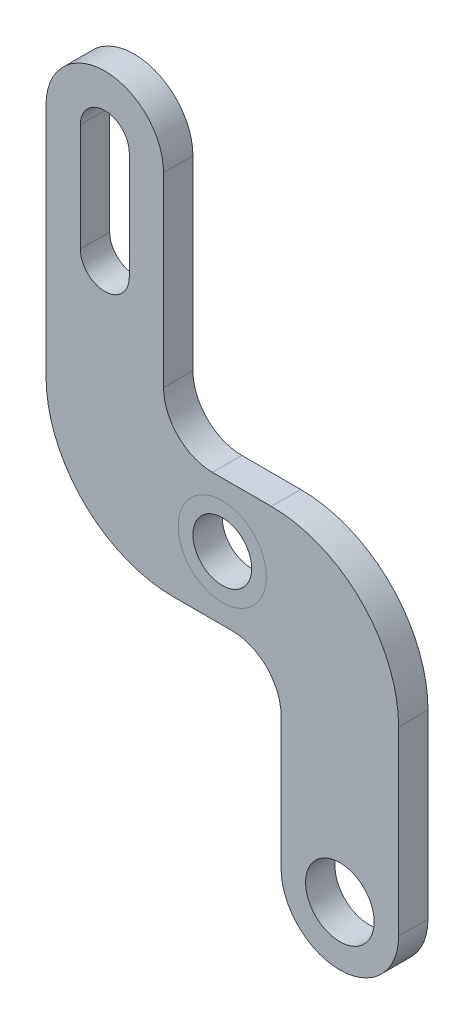
ISO-10303-21;
HEADER;
FILE_DESCRIPTION(('STEP AP214'),'2;1');
FILE_NAME('part.step','',(''),(''),'','','');
FILE_SCHEMA(('AUTOMOTIVE_DESIGN { 1 0 10303 214 1 1 1 1 }'));
ENDSEC;
DATA;
#1=APPLICATION_CONTEXT('core data for automotive mechanical design processes');
#2=APPLICATION_PROTOCOL_DEFINITION('international standard','automotive_design',2000,#1);
#3=PRODUCT_CONTEXT('',#1,'mechanical');
#4=PRODUCT('Part','Part','',(#3));
#5=PRODUCT_RELATED_PRODUCT_CATEGORY('part','',(#4));
#6=PRODUCT_DEFINITION_FORMATION('','',#4);
#7=PRODUCT_DEFINITION_CONTEXT('part definition',#1,'design');
#8=PRODUCT_DEFINITION('design','',#6,#7);
#9=PRODUCT_DEFINITION_SHAPE('','',#8);
#10=(LENGTH_UNIT() NAMED_UNIT(*) SI_UNIT(.MILLI.,.METRE.));
#11=(NAMED_UNIT(*) PLANE_ANGLE_UNIT() SI_UNIT($,.RADIAN.));
#12=(NAMED_UNIT(*) SI_UNIT($,.STERADIAN.) SOLID_ANGLE_UNIT());
#13=UNCERTAINTY_MEASURE_WITH_UNIT(LENGTH_MEASURE(1.E-05),#10,'distance_accuracy_value','');
#14=(GEOMETRIC_REPRESENTATION_CONTEXT(3) GLOBAL_UNCERTAINTY_ASSIGNED_CONTEXT((#13)) GLOBAL_UNIT_ASSIGNED_CONTEXT((#10,
#11,#12)) REPRESENTATION_CONTEXT('',''));
#15=CARTESIAN_POINT('',(0.,0.,0.));
#16=DIRECTION('',(0.,0.,1.));
#17=DIRECTION('',(1.,0.,0.));
#18=AXIS2_PLACEMENT_3D('',#15,#16,#17);
#19=CARTESIAN_POINT('',(0.,0.,1.5));
#20=DIRECTION('',(0.,0.,-1.));
#21=DIRECTION('',(-1.,0.,0.));
#22=AXIS2_PLACEMENT_3D('',#19,#20,#21);
#23=CYLINDRICAL_SURFACE('',#22,3.);
#24=CARTESIAN_POINT('',(0.,0.,1.5));
#25=DIRECTION('',(0.,0.,1.));
#26=DIRECTION('',(1.,0.,0.));
#27=AXIS2_PLACEMENT_3D('',#24,#25,#26);
#28=CIRCLE('',#27,3.);
#29=CARTESIAN_POINT('',(3.,0.,1.5));
#30=VERTEX_POINT('',#29);
#31=EDGE_CURVE('E52',#30,#30,#28,.T.);
#32=ORIENTED_EDGE('',*,*,#31,.T.);
#33=EDGE_LOOP('',(#32));
#34=FACE_BOUND('',#33,.T.);
#35=CARTESIAN_POINT('',(0.,0.,-1.5));
#36=DIRECTION('',(0.,0.,1.));
#37=DIRECTION('',(1.,0.,0.));
#38=AXIS2_PLACEMENT_3D('',#35,#36,#37);
#39=CIRCLE('',#38,3.);
#40=CARTESIAN_POINT('',(3.,0.,-1.5));
#41=VERTEX_POINT('',#40);
#42=EDGE_CURVE('E58',#41,#41,#39,.T.);
#43=ORIENTED_EDGE('',*,*,#42,.F.);
#44=EDGE_LOOP('',(#43));
#45=FACE_BOUND('',#44,.T.);
#46=ADVANCED_FACE('F45',(#34,#45),#23,.F.);
#47=CARTESIAN_POINT('',(0.,0.,1.5));
#48=DIRECTION('',(0.,0.,-1.));
#49=DIRECTION('',(-1.,0.,0.));
#50=AXIS2_PLACEMENT_3D('',#47,#48,#49);
#51=CYLINDRICAL_SURFACE('',#50,4.5);
#52=CARTESIAN_POINT('',(0.,0.,1.5));
#53=DIRECTION('',(0.,0.,1.));
#54=DIRECTION('',(1.,0.,0.));
#55=AXIS2_PLACEMENT_3D('',#52,#53,#54);
#56=CIRCLE('',#55,4.5);
#57=CARTESIAN_POINT('',(4.5,0.,1.5));
#58=VERTEX_POINT('',#57);
#59=EDGE_CURVE('E11',#58,#58,#56,.T.);
#60=ORIENTED_EDGE('',*,*,#59,.F.);
#61=EDGE_LOOP('',(#60));
#62=FACE_BOUND('',#61,.T.);
#63=CARTESIAN_POINT('',(0.,0.,-1.5));
#64=DIRECTION('',(0.,0.,1.));
#65=DIRECTION('',(1.,0.,0.));
#66=AXIS2_PLACEMENT_3D('',#63,#64,#65);
#67=CIRCLE('',#66,4.5);
#68=CARTESIAN_POINT('',(4.5,0.,-1.5));
#69=VERTEX_POINT('',#68);
#70=EDGE_CURVE('E48',#69,#69,#67,.T.);
#71=ORIENTED_EDGE('',*,*,#70,.T.);
#72=EDGE_LOOP('',(#71));
#73=FACE_BOUND('',#72,.T.);
#74=ADVANCED_FACE('F65',(#62,#73),#51,.T.);
#75=CARTESIAN_POINT('',(0.,0.,1.5));
#76=DIRECTION('',(0.,0.,1.));
#77=DIRECTION('',(1.,0.,0.));
#78=AXIS2_PLACEMENT_3D('',#75,#76,#77);
#79=PLANE('',#78);
#80=ORIENTED_EDGE('',*,*,#31,.F.);
#81=EDGE_LOOP('',(#80));
#82=FACE_BOUND('',#81,.T.);
#83=ORIENTED_EDGE('',*,*,#59,.T.);
#84=EDGE_LOOP('',(#83));
#85=FACE_BOUND('',#84,.T.);
#86=ADVANCED_FACE('F69',(#82,#85),#79,.T.);
#87=CARTESIAN_POINT('',(0.,0.,-1.5));
#88=DIRECTION('',(0.,0.,1.));
#89=DIRECTION('',(1.,0.,0.));
#90=AXIS2_PLACEMENT_3D('',#87,#88,#89);
#91=PLANE('',#90);
#92=ORIENTED_EDGE('',*,*,#42,.T.);
#93=EDGE_LOOP('',(#92));
#94=FACE_BOUND('',#93,.T.);
#95=ORIENTED_EDGE('',*,*,#70,.F.);
#96=EDGE_LOOP('',(#95));
#97=FACE_BOUND('',#96,.T.);
#98=ADVANCED_FACE('F67',(#94,#97),#91,.F.);
#99=CLOSED_SHELL('',(#46,#74,#86,#98));
#100=MANIFOLD_SOLID_BREP('B2',#99);
#101=CARTESIAN_POINT('',(12.,-25.,1.5));
#102=DIRECTION('',(0.,0.,-1.));
#103=DIRECTION('',(-1.,0.,0.));
#104=AXIS2_PLACEMENT_3D('',#101,#102,#103);
#105=CYLINDRICAL_SURFACE('',#104,6.);
#106=CARTESIAN_POINT('',(12.,-25.,-1.5));
#107=DIRECTION('',(0.,0.,1.));
#108=DIRECTION('',(1.,0.,0.));
#109=AXIS2_PLACEMENT_3D('',#106,#107,#108);
#110=CIRCLE('',#109,6.);
#111=CARTESIAN_POINT('',(18.,-25.,-1.5));
#112=VERTEX_POINT('',#111);
#113=CARTESIAN_POINT('',(6.,-25.,-1.5));
#114=VERTEX_POINT('',#113);
#115=EDGE_CURVE('E279',#112,#114,#110,.F.);
#116=ORIENTED_EDGE('',*,*,#115,.F.);
#117=DIRECTION('',(0.,0.,-1.));
#118=VECTOR('',#117,1.);
#119=CARTESIAN_POINT('',(18.,-25.,1.5));
#120=LINE('',#119,#118);
#121=CARTESIAN_POINT('',(18.,-25.,1.5));
#122=VERTEX_POINT('',#121);
#123=EDGE_CURVE('E43',#122,#112,#120,.T.);
#124=ORIENTED_EDGE('',*,*,#123,.F.);
#125=CARTESIAN_POINT('',(12.,-25.,1.5));
#126=DIRECTION('',(0.,0.,1.));
#127=DIRECTION('',(1.,0.,0.));
#128=AXIS2_PLACEMENT_3D('',#125,#126,#127);
#129=CIRCLE('',#128,6.);
#130=CARTESIAN_POINT('',(6.,-25.,1.5));
#131=VERTEX_POINT('',#130);
#132=EDGE_CURVE('E354',#122,#131,#129,.F.);
#133=ORIENTED_EDGE('',*,*,#132,.T.);
#134=DIRECTION('',(0.,0.,-1.));
#135=VECTOR('',#134,1.);
#136=CARTESIAN_POINT('',(6.,-25.,1.5));
#137=LINE('',#136,#135);
#138=EDGE_CURVE('E185',#131,#114,#137,.T.);
#139=ORIENTED_EDGE('',*,*,#138,.T.);
#140=EDGE_LOOP('',(#116,#124,#133,#139));
#141=FACE_BOUND('',#140,.T.);
#142=ADVANCED_FACE('F107',(#141),#105,.T.);
#143=CARTESIAN_POINT('',(18.,0.,1.5));
#144=DIRECTION('',(1.,0.,0.));
#145=DIRECTION('',(0.,1.,0.));
#146=AXIS2_PLACEMENT_3D('',#143,#144,#145);
#147=PLANE('',#146);
#148=DIRECTION('',(0.,-1.,0.));
#149=VECTOR('',#148,1.);
#150=CARTESIAN_POINT('',(18.,0.,-1.5));
#151=LINE('',#150,#149);
#152=CARTESIAN_POINT('',(18.,-6.5,-1.5));
#153=VERTEX_POINT('',#152);
#154=EDGE_CURVE('E281',#153,#112,#151,.T.);
#155=ORIENTED_EDGE('',*,*,#154,.F.);
#156=DIRECTION('',(0.,0.,-1.));
#157=VECTOR('',#156,1.);
#158=CARTESIAN_POINT('',(18.,-6.5,1.5));
#159=LINE('',#158,#157);
#160=CARTESIAN_POINT('',(18.,-6.5,1.5));
#161=VERTEX_POINT('',#160);
#162=EDGE_CURVE('E117',#161,#153,#159,.T.);
#163=ORIENTED_EDGE('',*,*,#162,.F.);
#164=DIRECTION('',(0.,-1.,0.));
#165=VECTOR('',#164,1.);
#166=CARTESIAN_POINT('',(18.,0.,1.5));
#167=LINE('',#166,#165);
#168=EDGE_CURVE('E362',#161,#122,#167,.T.);
#169=ORIENTED_EDGE('',*,*,#168,.T.);
#170=ORIENTED_EDGE('',*,*,#123,.T.);
#171=EDGE_LOOP('',(#155,#163,#169,#170));
#172=FACE_BOUND('',#171,.T.);
#173=ADVANCED_FACE('F408',(#172),#147,.T.);
#174=CARTESIAN_POINT('',(5.,-6.5,1.5));
#175=DIRECTION('',(0.,0.,-1.));
#176=DIRECTION('',(-1.,0.,0.));
#177=AXIS2_PLACEMENT_3D('',#174,#175,#176);
#178=CYLINDRICAL_SURFACE('',#177,13.);
#179=CARTESIAN_POINT('',(5.,-6.5,-1.5));
#180=DIRECTION('',(0.,0.,1.));
#181=DIRECTION('',(1.,0.,0.));
#182=AXIS2_PLACEMENT_3D('',#179,#180,#181);
#183=CIRCLE('',#182,13.);
#184=CARTESIAN_POINT('',(5.,6.5,-1.5));
#185=VERTEX_POINT('',#184);
#186=EDGE_CURVE('E284',#185,#153,#183,.F.);
#187=ORIENTED_EDGE('',*,*,#186,.F.);
#188=DIRECTION('',(0.,0.,-1.));
#189=VECTOR('',#188,1.);
#190=CARTESIAN_POINT('',(5.,6.5,1.5));
#191=LINE('',#190,#189);
#192=CARTESIAN_POINT('',(5.,6.5,1.5));
#193=VERTEX_POINT('',#192);
#194=EDGE_CURVE('E326',#193,#185,#191,.T.);
#195=ORIENTED_EDGE('',*,*,#194,.F.);
#196=CARTESIAN_POINT('',(5.,-6.5,1.5));
#197=DIRECTION('',(0.,0.,1.));
#198=DIRECTION('',(1.,0.,0.));
#199=AXIS2_PLACEMENT_3D('',#196,#197,#198);
#200=CIRCLE('',#199,13.);
#201=EDGE_CURVE('E365',#193,#161,#200,.F.);
#202=ORIENTED_EDGE('',*,*,#201,.T.);
#203=ORIENTED_EDGE('',*,*,#162,.T.);
#204=EDGE_LOOP('',(#187,#195,#202,#203));
#205=FACE_BOUND('',#204,.T.);
#206=ADVANCED_FACE('F413',(#205),#178,.T.);
#207=CARTESIAN_POINT('',(0.,6.5,1.5));
#208=DIRECTION('',(0.,1.,0.));
#209=DIRECTION('',(0.,0.,1.));
#210=AXIS2_PLACEMENT_3D('',#207,#208,#209);
#211=PLANE('',#210);
#212=DIRECTION('',(1.,0.,0.));
#213=VECTOR('',#212,1.);
#214=CARTESIAN_POINT('',(0.,6.5,-1.5));
#215=LINE('',#214,#213);
#216=CARTESIAN_POINT('',(-0.999999999999994,6.5,-1.5));
#217=VERTEX_POINT('',#216);
#218=EDGE_CURVE('E287',#217,#185,#215,.T.);
#219=ORIENTED_EDGE('',*,*,#218,.F.);
#220=DIRECTION('',(0.,0.,-1.));
#221=VECTOR('',#220,1.);
#222=CARTESIAN_POINT('',(-0.999999999999994,6.5,1.5));
#223=LINE('',#222,#221);
#224=CARTESIAN_POINT('',(-0.999999999999994,6.5,1.5));
#225=VERTEX_POINT('',#224);
#226=EDGE_CURVE('E324',#225,#217,#223,.T.);
#227=ORIENTED_EDGE('',*,*,#226,.F.);
#228=DIRECTION('',(1.,0.,0.));
#229=VECTOR('',#228,1.);
#230=CARTESIAN_POINT('',(0.,6.5,1.5));
#231=LINE('',#230,#229);
#232=EDGE_CURVE('E368',#225,#193,#231,.T.);
#233=ORIENTED_EDGE('',*,*,#232,.T.);
#234=ORIENTED_EDGE('',*,*,#194,.T.);
#235=EDGE_LOOP('',(#219,#227,#233,#234));
#236=FACE_BOUND('',#235,.T.);
#237=ADVANCED_FACE('F449',(#236),#211,.T.);
#238=CARTESIAN_POINT('',(-0.999999999999994,11.5,1.5));
#239=DIRECTION('',(0.,0.,-1.));
#240=DIRECTION('',(-1.,0.,0.));
#241=AXIS2_PLACEMENT_3D('',#238,#239,#240);
#242=CYLINDRICAL_SURFACE('',#241,5.);
#243=CARTESIAN_POINT('',(-0.999999999999994,11.5,-1.5));
#244=DIRECTION('',(0.,0.,1.));
#245=DIRECTION('',(1.,0.,0.));
#246=AXIS2_PLACEMENT_3D('',#243,#244,#245);
#247=CIRCLE('',#246,5.);
#248=CARTESIAN_POINT('',(-5.99999999999999,11.5,-1.5));
#249=VERTEX_POINT('',#248);
#250=EDGE_CURVE('E290',#249,#217,#247,.T.);
#251=ORIENTED_EDGE('',*,*,#250,.F.);
#252=DIRECTION('',(0.,0.,-1.));
#253=VECTOR('',#252,1.);
#254=CARTESIAN_POINT('',(-5.99999999999999,11.5,1.5));
#255=LINE('',#254,#253);
#256=CARTESIAN_POINT('',(-5.99999999999999,11.5,1.5));
#257=VERTEX_POINT('',#256);
#258=EDGE_CURVE('E322',#257,#249,#255,.T.);
#259=ORIENTED_EDGE('',*,*,#258,.F.);
#260=CARTESIAN_POINT('',(-0.999999999999994,11.5,1.5));
#261=DIRECTION('',(0.,0.,1.));
#262=DIRECTION('',(1.,0.,0.));
#263=AXIS2_PLACEMENT_3D('',#260,#261,#262);
#264=CIRCLE('',#263,5.);
#265=EDGE_CURVE('E371',#257,#225,#264,.T.);
#266=ORIENTED_EDGE('',*,*,#265,.T.);
#267=ORIENTED_EDGE('',*,*,#226,.T.);
#268=EDGE_LOOP('',(#251,#259,#266,#267));
#269=FACE_BOUND('',#268,.T.);
#270=ADVANCED_FACE('F445',(#269),#242,.F.);
#271=CARTESIAN_POINT('',(-5.99999999999999,0.,1.5));
#272=DIRECTION('',(1.,0.,0.));
#273=DIRECTION('',(0.,1.,0.));
#274=AXIS2_PLACEMENT_3D('',#271,#272,#273);
#275=PLANE('',#274);
#276=DIRECTION('',(0.,-1.,0.));
#277=VECTOR('',#276,1.);
#278=CARTESIAN_POINT('',(-5.99999999999999,0.,-1.5));
#279=LINE('',#278,#277);
#280=CARTESIAN_POINT('',(-6.,30.5,-1.5));
#281=VERTEX_POINT('',#280);
#282=EDGE_CURVE('E293',#281,#249,#279,.T.);
#283=ORIENTED_EDGE('',*,*,#282,.F.);
#284=DIRECTION('',(0.,0.,-1.));
#285=VECTOR('',#284,1.);
#286=CARTESIAN_POINT('',(-6.,30.5,1.5));
#287=LINE('',#286,#285);
#288=CARTESIAN_POINT('',(-6.,30.5,1.5));
#289=VERTEX_POINT('',#288);
#290=EDGE_CURVE('E320',#289,#281,#287,.T.);
#291=ORIENTED_EDGE('',*,*,#290,.F.);
#292=DIRECTION('',(0.,-1.,0.));
#293=VECTOR('',#292,1.);
#294=CARTESIAN_POINT('',(-5.99999999999999,0.,1.5));
#295=LINE('',#294,#293);
#296=EDGE_CURVE('E374',#289,#257,#295,.T.);
#297=ORIENTED_EDGE('',*,*,#296,.T.);
#298=ORIENTED_EDGE('',*,*,#258,.T.);
#299=EDGE_LOOP('',(#283,#291,#297,#298));
#300=FACE_BOUND('',#299,.T.);
#301=ADVANCED_FACE('F441',(#300),#275,.T.);
#302=CARTESIAN_POINT('',(-12.,30.5,1.5));
#303=DIRECTION('',(0.,0.,-1.));
#304=DIRECTION('',(-1.,0.,0.));
#305=AXIS2_PLACEMENT_3D('',#302,#303,#304);
#306=CYLINDRICAL_SURFACE('',#305,6.);
#307=CARTESIAN_POINT('',(-12.,30.5,-1.5));
#308=DIRECTION('',(0.,0.,1.));
#309=DIRECTION('',(1.,0.,0.));
#310=AXIS2_PLACEMENT_3D('',#307,#308,#309);
#311=CIRCLE('',#310,6.);
#312=CARTESIAN_POINT('',(-18.,30.5,-1.5));
#313=VERTEX_POINT('',#312);
#314=EDGE_CURVE('E296',#313,#281,#311,.F.);
#315=ORIENTED_EDGE('',*,*,#314,.F.);
#316=DIRECTION('',(0.,0.,-1.));
#317=VECTOR('',#316,1.);
#318=CARTESIAN_POINT('',(-18.,30.5,1.5));
#319=LINE('',#318,#317);
#320=CARTESIAN_POINT('',(-18.,30.5,1.5));
#321=VERTEX_POINT('',#320);
#322=EDGE_CURVE('E318',#321,#313,#319,.T.);
#323=ORIENTED_EDGE('',*,*,#322,.F.);
#324=CARTESIAN_POINT('',(-12.,30.5,1.5));
#325=DIRECTION('',(0.,0.,1.));
#326=DIRECTION('',(1.,0.,0.));
#327=AXIS2_PLACEMENT_3D('',#324,#325,#326);
#328=CIRCLE('',#327,6.);
#329=EDGE_CURVE('E377',#321,#289,#328,.F.);
#330=ORIENTED_EDGE('',*,*,#329,.T.);
#331=ORIENTED_EDGE('',*,*,#290,.T.);
#332=EDGE_LOOP('',(#315,#323,#330,#331));
#333=FACE_BOUND('',#332,.T.);
#334=ADVANCED_FACE('F438',(#333),#306,.T.);
#335=CARTESIAN_POINT('',(-18.,0.,1.5));
#336=DIRECTION('',(-1.,0.,0.));
#337=DIRECTION('',(0.,0.,1.));
#338=AXIS2_PLACEMENT_3D('',#335,#336,#337);
#339=PLANE('',#338);
#340=DIRECTION('',(0.,1.,0.));
#341=VECTOR('',#340,1.);
#342=CARTESIAN_POINT('',(-18.,0.,-1.5));
#343=LINE('',#342,#341);
#344=CARTESIAN_POINT('',(-18.,6.5,-1.5));
#345=VERTEX_POINT('',#344);
#346=EDGE_CURVE('E299',#345,#313,#343,.T.);
#347=ORIENTED_EDGE('',*,*,#346,.F.);
#348=DIRECTION('',(0.,0.,-1.));
#349=VECTOR('',#348,1.);
#350=CARTESIAN_POINT('',(-18.,6.5,1.5));
#351=LINE('',#350,#349);
#352=CARTESIAN_POINT('',(-18.,6.5,1.5));
#353=VERTEX_POINT('',#352);
#354=EDGE_CURVE('E316',#353,#345,#351,.T.);
#355=ORIENTED_EDGE('',*,*,#354,.F.);
#356=DIRECTION('',(0.,1.,0.));
#357=VECTOR('',#356,1.);
#358=CARTESIAN_POINT('',(-18.,0.,1.5));
#359=LINE('',#358,#357);
#360=EDGE_CURVE('E255',#353,#321,#359,.T.);
#361=ORIENTED_EDGE('',*,*,#360,.T.);
#362=ORIENTED_EDGE('',*,*,#322,.T.);
#363=EDGE_LOOP('',(#347,#355,#361,#362));
#364=FACE_BOUND('',#363,.T.);
#365=ADVANCED_FACE('F382',(#364),#339,.T.);
#366=CARTESIAN_POINT('',(-5.,6.5,1.5));
#367=DIRECTION('',(0.,0.,-1.));
#368=DIRECTION('',(-1.,0.,0.));
#369=AXIS2_PLACEMENT_3D('',#366,#367,#368);
#370=CYLINDRICAL_SURFACE('',#369,13.);
#371=CARTESIAN_POINT('',(-5.,6.5,-1.5));
#372=DIRECTION('',(0.,0.,1.));
#373=DIRECTION('',(1.,0.,0.));
#374=AXIS2_PLACEMENT_3D('',#371,#372,#373);
#375=CIRCLE('',#374,13.);
#376=CARTESIAN_POINT('',(-5.,-6.5,-1.5));
#377=VERTEX_POINT('',#376);
#378=EDGE_CURVE('E302',#377,#345,#375,.F.);
#379=ORIENTED_EDGE('',*,*,#378,.F.);
#380=DIRECTION('',(0.,0.,-1.));
#381=VECTOR('',#380,1.);
#382=CARTESIAN_POINT('',(-5.,-6.5,1.5));
#383=LINE('',#382,#381);
#384=CARTESIAN_POINT('',(-5.,-6.5,1.5));
#385=VERTEX_POINT('',#384);
#386=EDGE_CURVE('E241',#385,#377,#383,.T.);
#387=ORIENTED_EDGE('',*,*,#386,.F.);
#388=CARTESIAN_POINT('',(-5.,6.5,1.5));
#389=DIRECTION('',(0.,0.,1.));
#390=DIRECTION('',(1.,0.,0.));
#391=AXIS2_PLACEMENT_3D('',#388,#389,#390);
#392=CIRCLE('',#391,13.);
#393=EDGE_CURVE('E253',#385,#353,#392,.F.);
#394=ORIENTED_EDGE('',*,*,#393,.T.);
#395=ORIENTED_EDGE('',*,*,#354,.T.);
#396=EDGE_LOOP('',(#379,#387,#394,#395));
#397=FACE_BOUND('',#396,.T.);
#398=ADVANCED_FACE('F388',(#397),#370,.T.);
#399=CARTESIAN_POINT('',(0.,-6.5,1.5));
#400=DIRECTION('',(0.,-1.,0.));
#401=DIRECTION('',(1.,0.,0.));
#402=AXIS2_PLACEMENT_3D('',#399,#400,#401);
#403=PLANE('',#402);
#404=DIRECTION('',(-1.,0.,0.));
#405=VECTOR('',#404,1.);
#406=CARTESIAN_POINT('',(0.,-6.5,-1.5));
#407=LINE('',#406,#405);
#408=CARTESIAN_POINT('',(0.999999999999998,-6.5,-1.5));
#409=VERTEX_POINT('',#408);
#410=EDGE_CURVE('E238',#409,#377,#407,.T.);
#411=ORIENTED_EDGE('',*,*,#410,.F.);
#412=DIRECTION('',(0.,0.,-1.));
#413=VECTOR('',#412,1.);
#414=CARTESIAN_POINT('',(0.999999999999998,-6.5,1.5));
#415=LINE('',#414,#413);
#416=CARTESIAN_POINT('',(0.999999999999998,-6.5,1.5));
#417=VERTEX_POINT('',#416);
#418=EDGE_CURVE('E232',#417,#409,#415,.T.);
#419=ORIENTED_EDGE('',*,*,#418,.F.);
#420=DIRECTION('',(-1.,0.,0.));
#421=VECTOR('',#420,1.);
#422=CARTESIAN_POINT('',(0.,-6.5,1.5));
#423=LINE('',#422,#421);
#424=EDGE_CURVE('E236',#417,#385,#423,.T.);
#425=ORIENTED_EDGE('',*,*,#424,.T.);
#426=ORIENTED_EDGE('',*,*,#386,.T.);
#427=EDGE_LOOP('',(#411,#419,#425,#426));
#428=FACE_BOUND('',#427,.T.);
#429=ADVANCED_FACE('F234',(#428),#403,.T.);
#430=CARTESIAN_POINT('',(0.999999999999998,-11.5,1.5));
#431=DIRECTION('',(0.,0.,-1.));
#432=DIRECTION('',(-1.,0.,0.));
#433=AXIS2_PLACEMENT_3D('',#430,#431,#432);
#434=CYLINDRICAL_SURFACE('',#433,5.);
#435=CARTESIAN_POINT('',(0.999999999999998,-11.5,-1.5));
#436=DIRECTION('',(0.,0.,1.));
#437=DIRECTION('',(1.,0.,0.));
#438=AXIS2_PLACEMENT_3D('',#435,#436,#437);
#439=CIRCLE('',#438,5.);
#440=CARTESIAN_POINT('',(6.,-11.5,-1.5));
#441=VERTEX_POINT('',#440);
#442=EDGE_CURVE('E306',#409,#441,#439,.F.);
#443=ORIENTED_EDGE('',*,*,#442,.T.);
#444=DIRECTION('',(0.,0.,-1.));
#445=VECTOR('',#444,1.);
#446=CARTESIAN_POINT('',(6.,-11.5,1.5));
#447=LINE('',#446,#445);
#448=CARTESIAN_POINT('',(6.,-11.5,1.5));
#449=VERTEX_POINT('',#448);
#450=EDGE_CURVE('E242',#449,#441,#447,.T.);
#451=ORIENTED_EDGE('',*,*,#450,.F.);
#452=CARTESIAN_POINT('',(0.999999999999998,-11.5,1.5));
#453=DIRECTION('',(0.,0.,1.));
#454=DIRECTION('',(1.,0.,0.));
#455=AXIS2_PLACEMENT_3D('',#452,#453,#454);
#456=CIRCLE('',#455,5.);
#457=EDGE_CURVE('E245',#417,#449,#456,.F.);
#458=ORIENTED_EDGE('',*,*,#457,.F.);
#459=ORIENTED_EDGE('',*,*,#418,.T.);
#460=EDGE_LOOP('',(#443,#451,#458,#459));
#461=FACE_BOUND('',#460,.T.);
#462=ADVANCED_FACE('F246',(#461),#434,.F.);
#463=CARTESIAN_POINT('',(-12.,19.5,1.5));
#464=DIRECTION('',(0.,0.,-1.));
#465=DIRECTION('',(-1.,0.,0.));
#466=AXIS2_PLACEMENT_3D('',#463,#464,#465);
#467=CYLINDRICAL_SURFACE('',#466,2.5);
#468=CARTESIAN_POINT('',(-12.,19.5,-1.5));
#469=DIRECTION('',(0.,0.,1.));
#470=DIRECTION('',(1.,0.,0.));
#471=AXIS2_PLACEMENT_3D('',#468,#469,#470);
#472=CIRCLE('',#471,2.5);
#473=CARTESIAN_POINT('',(-14.5,19.5,-1.5));
#474=VERTEX_POINT('',#473);
#475=CARTESIAN_POINT('',(-9.5,19.5,-1.5));
#476=VERTEX_POINT('',#475);
#477=EDGE_CURVE('E267',#474,#476,#472,.T.);
#478=ORIENTED_EDGE('',*,*,#477,.F.);
#479=DIRECTION('',(0.,0.,-1.));
#480=VECTOR('',#479,1.);
#481=CARTESIAN_POINT('',(-14.5,19.5,1.5));
#482=LINE('',#481,#480);
#483=CARTESIAN_POINT('',(-14.5,19.5,1.5));
#484=VERTEX_POINT('',#483);
#485=EDGE_CURVE('E111',#484,#474,#482,.T.);
#486=ORIENTED_EDGE('',*,*,#485,.F.);
#487=CARTESIAN_POINT('',(-12.,19.5,1.5));
#488=DIRECTION('',(0.,0.,1.));
#489=DIRECTION('',(1.,0.,0.));
#490=AXIS2_PLACEMENT_3D('',#487,#488,#489);
#491=CIRCLE('',#490,2.5);
#492=CARTESIAN_POINT('',(-9.5,19.5,1.5));
#493=VERTEX_POINT('',#492);
#494=EDGE_CURVE('E357',#484,#493,#491,.T.);
#495=ORIENTED_EDGE('',*,*,#494,.T.);
#496=DIRECTION('',(0.,0.,-1.));
#497=VECTOR('',#496,1.);
#498=CARTESIAN_POINT('',(-9.5,19.5,1.5));
#499=LINE('',#498,#497);
#500=EDGE_CURVE('E263',#493,#476,#499,.T.);
#501=ORIENTED_EDGE('',*,*,#500,.T.);
#502=EDGE_LOOP('',(#478,#486,#495,#501));
#503=FACE_BOUND('',#502,.T.);
#504=ADVANCED_FACE('F341',(#503),#467,.F.);
#505=CARTESIAN_POINT('',(-14.5,0.,1.5));
#506=DIRECTION('',(1.,0.,0.));
#507=DIRECTION('',(0.,1.,0.));
#508=AXIS2_PLACEMENT_3D('',#505,#506,#507);
#509=PLANE('',#508);
#510=DIRECTION('',(0.,-1.,0.));
#511=VECTOR('',#510,1.);
#512=CARTESIAN_POINT('',(-14.5,0.,-1.5));
#513=LINE('',#512,#511);
#514=CARTESIAN_POINT('',(-14.5,30.5,-1.5));
#515=VERTEX_POINT('',#514);
#516=EDGE_CURVE('E270',#515,#474,#513,.T.);
#517=ORIENTED_EDGE('',*,*,#516,.F.);
#518=DIRECTION('',(0.,0.,-1.));
#519=VECTOR('',#518,1.);
#520=CARTESIAN_POINT('',(-14.5,30.5,1.5));
#521=LINE('',#520,#519);
#522=CARTESIAN_POINT('',(-14.5,30.5,1.5));
#523=VERTEX_POINT('',#522);
#524=EDGE_CURVE('E331',#523,#515,#521,.T.);
#525=ORIENTED_EDGE('',*,*,#524,.F.);
#526=DIRECTION('',(0.,-1.,0.));
#527=VECTOR('',#526,1.);
#528=CARTESIAN_POINT('',(-14.5,0.,1.5));
#529=LINE('',#528,#527);
#530=EDGE_CURVE('E340',#523,#484,#529,.T.);
#531=ORIENTED_EDGE('',*,*,#530,.T.);
#532=ORIENTED_EDGE('',*,*,#485,.T.);
#533=EDGE_LOOP('',(#517,#525,#531,#532));
#534=FACE_BOUND('',#533,.T.);
#535=ADVANCED_FACE('F338',(#534),#509,.T.);
#536=CARTESIAN_POINT('',(-12.,30.5,1.5));
#537=DIRECTION('',(0.,0.,-1.));
#538=DIRECTION('',(-1.,0.,0.));
#539=AXIS2_PLACEMENT_3D('',#536,#537,#538);
#540=CYLINDRICAL_SURFACE('',#539,2.5);
#541=CARTESIAN_POINT('',(-12.,30.5,-1.5));
#542=DIRECTION('',(0.,0.,1.));
#543=DIRECTION('',(1.,0.,0.));
#544=AXIS2_PLACEMENT_3D('',#541,#542,#543);
#545=CIRCLE('',#544,2.5);
#546=CARTESIAN_POINT('',(-9.5,30.5,-1.5));
#547=VERTEX_POINT('',#546);
#548=EDGE_CURVE('E273',#547,#515,#545,.T.);
#549=ORIENTED_EDGE('',*,*,#548,.F.);
#550=DIRECTION('',(0.,0.,-1.));
#551=VECTOR('',#550,1.);
#552=CARTESIAN_POINT('',(-9.5,30.5,1.5));
#553=LINE('',#552,#551);
#554=CARTESIAN_POINT('',(-9.5,30.5,1.5));
#555=VERTEX_POINT('',#554);
#556=EDGE_CURVE('E330',#555,#547,#553,.T.);
#557=ORIENTED_EDGE('',*,*,#556,.F.);
#558=CARTESIAN_POINT('',(-12.,30.5,1.5));
#559=DIRECTION('',(0.,0.,1.));
#560=DIRECTION('',(1.,0.,0.));
#561=AXIS2_PLACEMENT_3D('',#558,#559,#560);
#562=CIRCLE('',#561,2.5);
#563=EDGE_CURVE('E349',#555,#523,#562,.T.);
#564=ORIENTED_EDGE('',*,*,#563,.T.);
#565=ORIENTED_EDGE('',*,*,#524,.T.);
#566=EDGE_LOOP('',(#549,#557,#564,#565));
#567=FACE_BOUND('',#566,.T.);
#568=ADVANCED_FACE('F346',(#567),#540,.F.);
#569=CARTESIAN_POINT('',(6.,0.,1.5));
#570=DIRECTION('',(1.,0.,0.));
#571=DIRECTION('',(0.,1.,0.));
#572=AXIS2_PLACEMENT_3D('',#569,#570,#571);
#573=PLANE('',#572);
#574=DIRECTION('',(0.,-1.,0.));
#575=VECTOR('',#574,1.);
#576=CARTESIAN_POINT('',(6.,0.,-1.5));
#577=LINE('',#576,#575);
#578=EDGE_CURVE('E178',#441,#114,#577,.T.);
#579=ORIENTED_EDGE('',*,*,#578,.T.);
#580=ORIENTED_EDGE('',*,*,#138,.F.);
#581=DIRECTION('',(0.,-1.,0.));
#582=VECTOR('',#581,1.);
#583=CARTESIAN_POINT('',(6.,0.,1.5));
#584=LINE('',#583,#582);
#585=EDGE_CURVE('E126',#449,#131,#584,.T.);
#586=ORIENTED_EDGE('',*,*,#585,.F.);
#587=ORIENTED_EDGE('',*,*,#450,.T.);
#588=EDGE_LOOP('',(#579,#580,#586,#587));
#589=FACE_BOUND('',#588,.T.);
#590=ADVANCED_FACE('F420',(#589),#573,.F.);
#591=CARTESIAN_POINT('',(-9.5,0.,1.5));
#592=DIRECTION('',(1.,0.,0.));
#593=DIRECTION('',(0.,0.,-1.));
#594=AXIS2_PLACEMENT_3D('',#591,#592,#593);
#595=PLANE('',#594);
#596=DIRECTION('',(0.,-1.,0.));
#597=VECTOR('',#596,1.);
#598=CARTESIAN_POINT('',(-9.5,0.,-1.5));
#599=LINE('',#598,#597);
#600=EDGE_CURVE('E276',#547,#476,#599,.T.);
#601=ORIENTED_EDGE('',*,*,#600,.T.);
#602=ORIENTED_EDGE('',*,*,#500,.F.);
#603=DIRECTION('',(0.,-1.,0.));
#604=VECTOR('',#603,1.);
#605=CARTESIAN_POINT('',(-9.5,0.,1.5));
#606=LINE('',#605,#604);
#607=EDGE_CURVE('E351',#555,#493,#606,.T.);
#608=ORIENTED_EDGE('',*,*,#607,.F.);
#609=ORIENTED_EDGE('',*,*,#556,.T.);
#610=EDGE_LOOP('',(#601,#602,#608,#609));
#611=FACE_BOUND('',#610,.T.);
#612=ADVANCED_FACE('F352',(#611),#595,.F.);
#613=CARTESIAN_POINT('',(12.,-25.,1.5));
#614=DIRECTION('',(0.,0.,-1.));
#615=DIRECTION('',(-1.,0.,0.));
#616=AXIS2_PLACEMENT_3D('',#613,#614,#615);
#617=CYLINDRICAL_SURFACE('',#616,3.5);
#618=CARTESIAN_POINT('',(12.,-25.,1.5));
#619=DIRECTION('',(0.,0.,1.));
#620=DIRECTION('',(1.,0.,0.));
#621=AXIS2_PLACEMENT_3D('',#618,#619,#620);
#622=CIRCLE('',#621,3.5);
#623=CARTESIAN_POINT('',(15.5,-25.,1.5));
#624=VERTEX_POINT('',#623);
#625=EDGE_CURVE('E312',#624,#624,#622,.T.);
#626=ORIENTED_EDGE('',*,*,#625,.T.);
#627=EDGE_LOOP('',(#626));
#628=FACE_BOUND('',#627,.T.);
#629=CARTESIAN_POINT('',(12.,-25.,-1.5));
#630=DIRECTION('',(0.,0.,1.));
#631=DIRECTION('',(1.,0.,0.));
#632=AXIS2_PLACEMENT_3D('',#629,#630,#631);
#633=CIRCLE('',#632,3.5);
#634=CARTESIAN_POINT('',(15.5,-25.,-1.5));
#635=VERTEX_POINT('',#634);
#636=EDGE_CURVE('E264',#635,#635,#633,.T.);
#637=ORIENTED_EDGE('',*,*,#636,.F.);
#638=EDGE_LOOP('',(#637));
#639=FACE_BOUND('',#638,.T.);
#640=ADVANCED_FACE('F109',(#628,#639),#617,.F.);
#641=CARTESIAN_POINT('',(0.,0.,1.5));
#642=DIRECTION('',(0.,0.,-1.));
#643=DIRECTION('',(-1.,0.,0.));
#644=AXIS2_PLACEMENT_3D('',#641,#642,#643);
#645=CYLINDRICAL_SURFACE('',#644,4.5);
#646=CARTESIAN_POINT('',(0.,0.,1.5));
#647=DIRECTION('',(0.,0.,1.));
#648=DIRECTION('',(1.,0.,0.));
#649=AXIS2_PLACEMENT_3D('',#646,#647,#648);
#650=CIRCLE('',#649,4.5);
#651=CARTESIAN_POINT('',(4.5,0.,1.5));
#652=VERTEX_POINT('',#651);
#653=EDGE_CURVE('E260',#652,#652,#650,.T.);
#654=ORIENTED_EDGE('',*,*,#653,.T.);
#655=EDGE_LOOP('',(#654));
#656=FACE_BOUND('',#655,.T.);
#657=CARTESIAN_POINT('',(0.,0.,-1.5));
#658=DIRECTION('',(0.,0.,1.));
#659=DIRECTION('',(1.,0.,0.));
#660=AXIS2_PLACEMENT_3D('',#657,#658,#659);
#661=CIRCLE('',#660,4.5);
#662=CARTESIAN_POINT('',(4.5,0.,-1.5));
#663=VERTEX_POINT('',#662);
#664=EDGE_CURVE('E309',#663,#663,#661,.T.);
#665=ORIENTED_EDGE('',*,*,#664,.F.);
#666=EDGE_LOOP('',(#665));
#667=FACE_BOUND('',#666,.T.);
#668=ADVANCED_FACE('F395',(#656,#667),#645,.F.);
#669=CARTESIAN_POINT('',(0.,0.,1.5));
#670=DIRECTION('',(0.,0.,1.));
#671=DIRECTION('',(1.,0.,0.));
#672=AXIS2_PLACEMENT_3D('',#669,#670,#671);
#673=PLANE('',#672);
#674=ORIENTED_EDGE('',*,*,#625,.F.);
#675=EDGE_LOOP('',(#674));
#676=FACE_BOUND('',#675,.T.);
#677=ORIENTED_EDGE('',*,*,#494,.F.);
#678=ORIENTED_EDGE('',*,*,#530,.F.);
#679=ORIENTED_EDGE('',*,*,#563,.F.);
#680=ORIENTED_EDGE('',*,*,#607,.T.);
#681=EDGE_LOOP('',(#677,#678,#679,#680));
#682=FACE_BOUND('',#681,.T.);
#683=ORIENTED_EDGE('',*,*,#132,.F.);
#684=ORIENTED_EDGE('',*,*,#168,.F.);
#685=ORIENTED_EDGE('',*,*,#201,.F.);
#686=ORIENTED_EDGE('',*,*,#232,.F.);
#687=ORIENTED_EDGE('',*,*,#265,.F.);
#688=ORIENTED_EDGE('',*,*,#296,.F.);
#689=ORIENTED_EDGE('',*,*,#329,.F.);
#690=ORIENTED_EDGE('',*,*,#360,.F.);
#691=ORIENTED_EDGE('',*,*,#393,.F.);
#692=ORIENTED_EDGE('',*,*,#424,.F.);
#693=ORIENTED_EDGE('',*,*,#457,.T.);
#694=ORIENTED_EDGE('',*,*,#585,.T.);
#695=EDGE_LOOP('',(#683,#684,#685,#686,#687,#688,#689,#690,#691,#692,#693,#694));
#696=FACE_BOUND('',#695,.T.);
#697=ORIENTED_EDGE('',*,*,#653,.F.);
#698=EDGE_LOOP('',(#697));
#699=FACE_BOUND('',#698,.T.);
#700=ADVANCED_FACE('F249',(#676,#682,#696,#699),#673,.T.);
#701=CARTESIAN_POINT('',(0.,0.,-1.5));
#702=DIRECTION('',(0.,0.,1.));
#703=DIRECTION('',(1.,0.,0.));
#704=AXIS2_PLACEMENT_3D('',#701,#702,#703);
#705=PLANE('',#704);
#706=ORIENTED_EDGE('',*,*,#636,.T.);
#707=EDGE_LOOP('',(#706));
#708=FACE_BOUND('',#707,.T.);
#709=ORIENTED_EDGE('',*,*,#477,.T.);
#710=ORIENTED_EDGE('',*,*,#600,.F.);
#711=ORIENTED_EDGE('',*,*,#548,.T.);
#712=ORIENTED_EDGE('',*,*,#516,.T.);
#713=EDGE_LOOP('',(#709,#710,#711,#712));
#714=FACE_BOUND('',#713,.T.);
#715=ORIENTED_EDGE('',*,*,#115,.T.);
#716=ORIENTED_EDGE('',*,*,#578,.F.);
#717=ORIENTED_EDGE('',*,*,#442,.F.);
#718=ORIENTED_EDGE('',*,*,#410,.T.);
#719=ORIENTED_EDGE('',*,*,#378,.T.);
#720=ORIENTED_EDGE('',*,*,#346,.T.);
#721=ORIENTED_EDGE('',*,*,#314,.T.);
#722=ORIENTED_EDGE('',*,*,#282,.T.);
#723=ORIENTED_EDGE('',*,*,#250,.T.);
#724=ORIENTED_EDGE('',*,*,#218,.T.);
#725=ORIENTED_EDGE('',*,*,#186,.T.);
#726=ORIENTED_EDGE('',*,*,#154,.T.);
#727=EDGE_LOOP('',(#715,#716,#717,#718,#719,#720,#721,#722,#723,#724,#725,#726));
#728=FACE_BOUND('',#727,.T.);
#729=ORIENTED_EDGE('',*,*,#664,.T.);
#730=EDGE_LOOP('',(#729));
#731=FACE_BOUND('',#730,.T.);
#732=ADVANCED_FACE('F345',(#708,#714,#728,#731),#705,.F.);
#733=CLOSED_SHELL('',(#142,#173,#206,#237,#270,#301,#334,#365,#398,#429,#462,#504,#535,#568,
#590,#612,#640,#668,#700,#732));
#734=MANIFOLD_SOLID_BREP('B6',#733);
#735=ADVANCED_BREP_SHAPE_REPRESENTATION('',(#18,#100,#734),#14);
#736=SHAPE_DEFINITION_REPRESENTATION(#9,#735);
ENDSEC;
END-ISO-10303-21;
